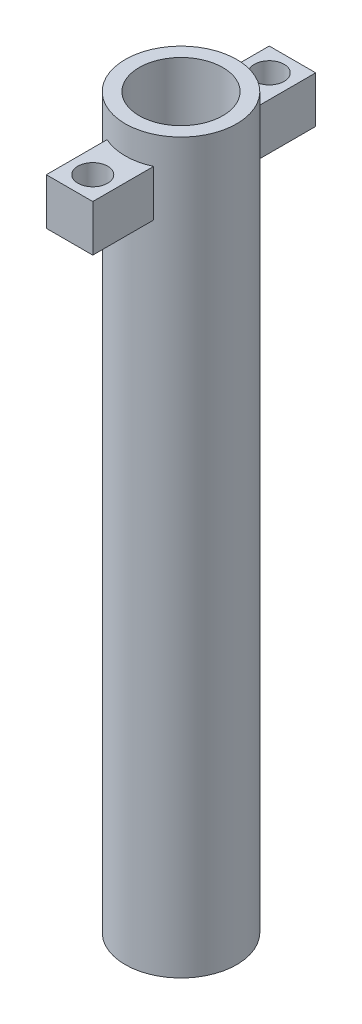
ISO-10303-21;
HEADER;
FILE_DESCRIPTION(('STEP AP214'),'2;1');
FILE_NAME('part.step','',(''),(''),'','','');
FILE_SCHEMA(('AUTOMOTIVE_DESIGN { 1 0 10303 214 1 1 1 1 }'));
ENDSEC;
DATA;
#1=APPLICATION_CONTEXT('core data for automotive mechanical design processes');
#2=APPLICATION_PROTOCOL_DEFINITION('international standard','automotive_design',2000,#1);
#3=PRODUCT_CONTEXT('',#1,'mechanical');
#4=PRODUCT('Part','Part','',(#3));
#5=PRODUCT_RELATED_PRODUCT_CATEGORY('part','',(#4));
#6=PRODUCT_DEFINITION_FORMATION('','',#4);
#7=PRODUCT_DEFINITION_CONTEXT('part definition',#1,'design');
#8=PRODUCT_DEFINITION('design','',#6,#7);
#9=PRODUCT_DEFINITION_SHAPE('','',#8);
#10=(LENGTH_UNIT() NAMED_UNIT(*) SI_UNIT(.MILLI.,.METRE.));
#11=(NAMED_UNIT(*) PLANE_ANGLE_UNIT() SI_UNIT($,.RADIAN.));
#12=(NAMED_UNIT(*) SI_UNIT($,.STERADIAN.) SOLID_ANGLE_UNIT());
#13=UNCERTAINTY_MEASURE_WITH_UNIT(LENGTH_MEASURE(1.E-05),#10,'distance_accuracy_value','');
#14=(GEOMETRIC_REPRESENTATION_CONTEXT(3) GLOBAL_UNCERTAINTY_ASSIGNED_CONTEXT((#13)) GLOBAL_UNIT_ASSIGNED_CONTEXT((#10,
#11,#12)) REPRESENTATION_CONTEXT('',''));
#15=CARTESIAN_POINT('',(0.,0.,0.));
#16=DIRECTION('',(0.,0.,1.));
#17=DIRECTION('',(1.,0.,0.));
#18=AXIS2_PLACEMENT_3D('',#15,#16,#17);
#19=CARTESIAN_POINT('',(0.,78.4,0.));
#20=DIRECTION('',(0.,1.,0.));
#21=DIRECTION('',(0.,0.,1.));
#22=AXIS2_PLACEMENT_3D('',#19,#20,#21);
#23=PLANE('',#22);
#24=CARTESIAN_POINT('',(0.,78.4,0.));
#25=DIRECTION('',(0.,1.,0.));
#26=DIRECTION('',(0.,0.,1.));
#27=AXIS2_PLACEMENT_3D('',#24,#25,#26);
#28=CIRCLE('',#27,4.5);
#29=CARTESIAN_POINT('',(0.,78.4,4.5));
#30=VERTEX_POINT('',#29);
#31=EDGE_CURVE('E150',#30,#30,#28,.T.);
#32=ORIENTED_EDGE('',*,*,#31,.F.);
#33=EDGE_LOOP('',(#32));
#34=FACE_BOUND('',#33,.T.);
#35=CARTESIAN_POINT('',(0.,78.4,0.));
#36=DIRECTION('',(0.,1.,0.));
#37=DIRECTION('',(0.,0.,1.));
#38=AXIS2_PLACEMENT_3D('',#35,#36,#37);
#39=CIRCLE('',#38,6.);
#40=CARTESIAN_POINT('',(0.,78.4,6.));
#41=VERTEX_POINT('',#40);
#42=EDGE_CURVE('E12',#41,#41,#39,.T.);
#43=ORIENTED_EDGE('',*,*,#42,.T.);
#44=EDGE_LOOP('',(#43));
#45=FACE_BOUND('',#44,.T.);
#46=ADVANCED_FACE('F39',(#34,#45),#23,.T.);
#47=CARTESIAN_POINT('',(-2.5,70.4,12.));
#48=DIRECTION('',(0.,0.,1.));
#49=DIRECTION('',(1.,0.,0.));
#50=AXIS2_PLACEMENT_3D('',#47,#48,#49);
#51=PLANE('',#50);
#52=DIRECTION('',(0.,1.,0.));
#53=VECTOR('',#52,1.);
#54=CARTESIAN_POINT('',(2.5,70.4,12.));
#55=LINE('',#54,#53);
#56=CARTESIAN_POINT('',(2.5,70.4,12.));
#57=VERTEX_POINT('',#56);
#58=CARTESIAN_POINT('',(2.5,75.4,12.));
#59=VERTEX_POINT('',#58);
#60=EDGE_CURVE('E135',#57,#59,#55,.T.);
#61=ORIENTED_EDGE('',*,*,#60,.T.);
#62=DIRECTION('',(-1.,0.,0.));
#63=VECTOR('',#62,1.);
#64=CARTESIAN_POINT('',(-2.5,75.4,12.));
#65=LINE('',#64,#63);
#66=CARTESIAN_POINT('',(-2.5,75.4,12.));
#67=VERTEX_POINT('',#66);
#68=EDGE_CURVE('E217',#59,#67,#65,.T.);
#69=ORIENTED_EDGE('',*,*,#68,.T.);
#70=DIRECTION('',(0.,1.,0.));
#71=VECTOR('',#70,1.);
#72=CARTESIAN_POINT('',(-2.5,70.4,12.));
#73=LINE('',#72,#71);
#74=CARTESIAN_POINT('',(-2.5,70.4,12.));
#75=VERTEX_POINT('',#74);
#76=EDGE_CURVE('E141',#75,#67,#73,.T.);
#77=ORIENTED_EDGE('',*,*,#76,.F.);
#78=DIRECTION('',(1.,0.,0.));
#79=VECTOR('',#78,1.);
#80=CARTESIAN_POINT('',(-2.5,70.4,12.));
#81=LINE('',#80,#79);
#82=EDGE_CURVE('E216',#75,#57,#81,.T.);
#83=ORIENTED_EDGE('',*,*,#82,.T.);
#84=EDGE_LOOP('',(#61,#69,#77,#83));
#85=FACE_BOUND('',#84,.T.);
#86=ADVANCED_FACE('F180',(#85),#51,.T.);
#87=CARTESIAN_POINT('',(0.,70.4,9.5));
#88=DIRECTION('',(0.,1.,0.));
#89=DIRECTION('',(0.,0.,1.));
#90=AXIS2_PLACEMENT_3D('',#87,#88,#89);
#91=CYLINDRICAL_SURFACE('',#90,1.6);
#92=CARTESIAN_POINT('',(0.,70.4,9.5));
#93=DIRECTION('',(0.,1.,0.));
#94=DIRECTION('',(0.,0.,1.));
#95=AXIS2_PLACEMENT_3D('',#92,#93,#94);
#96=CIRCLE('',#95,1.6);
#97=CARTESIAN_POINT('',(0.,70.4,11.1));
#98=VERTEX_POINT('',#97);
#99=EDGE_CURVE('E251',#98,#98,#96,.T.);
#100=ORIENTED_EDGE('',*,*,#99,.F.);
#101=EDGE_LOOP('',(#100));
#102=FACE_BOUND('',#101,.T.);
#103=CARTESIAN_POINT('',(0.,75.4,9.5));
#104=DIRECTION('',(0.,1.,0.));
#105=DIRECTION('',(0.,0.,1.));
#106=AXIS2_PLACEMENT_3D('',#103,#104,#105);
#107=CIRCLE('',#106,1.6);
#108=CARTESIAN_POINT('',(0.,75.4,11.1));
#109=VERTEX_POINT('',#108);
#110=EDGE_CURVE('E248',#109,#109,#107,.F.);
#111=ORIENTED_EDGE('',*,*,#110,.F.);
#112=EDGE_LOOP('',(#111));
#113=FACE_BOUND('',#112,.T.);
#114=ADVANCED_FACE('F186',(#102,#113),#91,.F.);
#115=CARTESIAN_POINT('',(-2.5,70.4,5.45435605731786));
#116=DIRECTION('',(-1.,0.,0.));
#117=DIRECTION('',(0.,0.,1.));
#118=AXIS2_PLACEMENT_3D('',#115,#116,#117);
#119=PLANE('',#118);
#120=ORIENTED_EDGE('',*,*,#76,.T.);
#121=DIRECTION('',(0.,0.,-1.));
#122=VECTOR('',#121,1.);
#123=CARTESIAN_POINT('',(-2.5,75.4,5.45435605731786));
#124=LINE('',#123,#122);
#125=CARTESIAN_POINT('',(-2.5,75.4,5.45435605731786));
#126=VERTEX_POINT('',#125);
#127=EDGE_CURVE('E210',#67,#126,#124,.T.);
#128=ORIENTED_EDGE('',*,*,#127,.T.);
#129=DIRECTION('',(0.,1.,0.));
#130=VECTOR('',#129,1.);
#131=CARTESIAN_POINT('',(-2.5,70.4,5.45435605731786));
#132=LINE('',#131,#130);
#133=CARTESIAN_POINT('',(-2.5,70.4,5.45435605731786));
#134=VERTEX_POINT('',#133);
#135=EDGE_CURVE('E144',#134,#126,#132,.T.);
#136=ORIENTED_EDGE('',*,*,#135,.F.);
#137=DIRECTION('',(0.,0.,1.));
#138=VECTOR('',#137,1.);
#139=CARTESIAN_POINT('',(-2.5,70.4,5.45435605731786));
#140=LINE('',#139,#138);
#141=EDGE_CURVE('E212',#134,#75,#140,.T.);
#142=ORIENTED_EDGE('',*,*,#141,.T.);
#143=EDGE_LOOP('',(#120,#128,#136,#142));
#144=FACE_BOUND('',#143,.T.);
#145=ADVANCED_FACE('F195',(#144),#119,.T.);
#146=CARTESIAN_POINT('',(2.5,70.4,5.45435605731786));
#147=DIRECTION('',(1.,0.,0.));
#148=DIRECTION('',(0.,0.,-1.));
#149=AXIS2_PLACEMENT_3D('',#146,#147,#148);
#150=PLANE('',#149);
#151=DIRECTION('',(0.,1.,0.));
#152=VECTOR('',#151,1.);
#153=CARTESIAN_POINT('',(2.5,70.4,5.45435605731786));
#154=LINE('',#153,#152);
#155=CARTESIAN_POINT('',(2.5,70.4,5.45435605731786));
#156=VERTEX_POINT('',#155);
#157=CARTESIAN_POINT('',(2.5,75.4,5.45435605731786));
#158=VERTEX_POINT('',#157);
#159=EDGE_CURVE('E130',#156,#158,#154,.T.);
#160=ORIENTED_EDGE('',*,*,#159,.T.);
#161=DIRECTION('',(0.,0.,1.));
#162=VECTOR('',#161,1.);
#163=CARTESIAN_POINT('',(2.5,75.4,5.45435605731786));
#164=LINE('',#163,#162);
#165=EDGE_CURVE('E240',#158,#59,#164,.T.);
#166=ORIENTED_EDGE('',*,*,#165,.T.);
#167=ORIENTED_EDGE('',*,*,#60,.F.);
#168=DIRECTION('',(0.,0.,-1.));
#169=VECTOR('',#168,1.);
#170=CARTESIAN_POINT('',(2.5,70.4,5.45435605731786));
#171=LINE('',#170,#169);
#172=EDGE_CURVE('E222',#57,#156,#171,.T.);
#173=ORIENTED_EDGE('',*,*,#172,.T.);
#174=EDGE_LOOP('',(#160,#166,#167,#173));
#175=FACE_BOUND('',#174,.T.);
#176=ADVANCED_FACE('F199',(#175),#150,.T.);
#177=CARTESIAN_POINT('',(-2.5,70.4,-12.));
#178=DIRECTION('',(-1.,0.,0.));
#179=DIRECTION('',(0.,0.,1.));
#180=AXIS2_PLACEMENT_3D('',#177,#178,#179);
#181=PLANE('',#180);
#182=DIRECTION('',(0.,1.,0.));
#183=VECTOR('',#182,1.);
#184=CARTESIAN_POINT('',(-2.5,70.4,-5.45435605731786));
#185=LINE('',#184,#183);
#186=CARTESIAN_POINT('',(-2.5,70.4,-5.45435605731786));
#187=VERTEX_POINT('',#186);
#188=CARTESIAN_POINT('',(-2.5,75.4,-5.45435605731786));
#189=VERTEX_POINT('',#188);
#190=EDGE_CURVE('E149',#187,#189,#185,.T.);
#191=ORIENTED_EDGE('',*,*,#190,.T.);
#192=DIRECTION('',(0.,0.,-1.));
#193=VECTOR('',#192,1.);
#194=CARTESIAN_POINT('',(-2.5,75.4,-12.));
#195=LINE('',#194,#193);
#196=CARTESIAN_POINT('',(-2.5,75.4,-12.));
#197=VERTEX_POINT('',#196);
#198=EDGE_CURVE('E115',#189,#197,#195,.T.);
#199=ORIENTED_EDGE('',*,*,#198,.T.);
#200=DIRECTION('',(0.,1.,0.));
#201=VECTOR('',#200,1.);
#202=CARTESIAN_POINT('',(-2.5,70.4,-12.));
#203=LINE('',#202,#201);
#204=CARTESIAN_POINT('',(-2.5,70.4,-12.));
#205=VERTEX_POINT('',#204);
#206=EDGE_CURVE('E132',#205,#197,#203,.T.);
#207=ORIENTED_EDGE('',*,*,#206,.F.);
#208=DIRECTION('',(0.,0.,1.));
#209=VECTOR('',#208,1.);
#210=CARTESIAN_POINT('',(-2.5,70.4,-12.));
#211=LINE('',#210,#209);
#212=EDGE_CURVE('E146',#205,#187,#211,.T.);
#213=ORIENTED_EDGE('',*,*,#212,.T.);
#214=EDGE_LOOP('',(#191,#199,#207,#213));
#215=FACE_BOUND('',#214,.T.);
#216=ADVANCED_FACE('F206',(#215),#181,.T.);
#217=CARTESIAN_POINT('',(-2.5,70.4,-12.));
#218=DIRECTION('',(0.,0.,-1.));
#219=DIRECTION('',(-1.,0.,0.));
#220=AXIS2_PLACEMENT_3D('',#217,#218,#219);
#221=PLANE('',#220);
#222=ORIENTED_EDGE('',*,*,#206,.T.);
#223=DIRECTION('',(1.,0.,0.));
#224=VECTOR('',#223,1.);
#225=CARTESIAN_POINT('',(-2.5,75.4,-12.));
#226=LINE('',#225,#224);
#227=CARTESIAN_POINT('',(2.5,75.4,-12.));
#228=VERTEX_POINT('',#227);
#229=EDGE_CURVE('E127',#197,#228,#226,.T.);
#230=ORIENTED_EDGE('',*,*,#229,.T.);
#231=DIRECTION('',(0.,1.,0.));
#232=VECTOR('',#231,1.);
#233=CARTESIAN_POINT('',(2.5,70.4,-12.));
#234=LINE('',#233,#232);
#235=CARTESIAN_POINT('',(2.5,70.4,-12.));
#236=VERTEX_POINT('',#235);
#237=EDGE_CURVE('E126',#236,#228,#234,.T.);
#238=ORIENTED_EDGE('',*,*,#237,.F.);
#239=DIRECTION('',(-1.,0.,0.));
#240=VECTOR('',#239,1.);
#241=CARTESIAN_POINT('',(-2.5,70.4,-12.));
#242=LINE('',#241,#240);
#243=EDGE_CURVE('E231',#236,#205,#242,.T.);
#244=ORIENTED_EDGE('',*,*,#243,.T.);
#245=EDGE_LOOP('',(#222,#230,#238,#244));
#246=FACE_BOUND('',#245,.T.);
#247=ADVANCED_FACE('F237',(#246),#221,.T.);
#248=CARTESIAN_POINT('',(2.5,70.4,-12.));
#249=DIRECTION('',(1.,0.,0.));
#250=DIRECTION('',(0.,0.,-1.));
#251=AXIS2_PLACEMENT_3D('',#248,#249,#250);
#252=PLANE('',#251);
#253=ORIENTED_EDGE('',*,*,#237,.T.);
#254=DIRECTION('',(0.,0.,1.));
#255=VECTOR('',#254,1.);
#256=CARTESIAN_POINT('',(2.5,75.4,-12.));
#257=LINE('',#256,#255);
#258=CARTESIAN_POINT('',(2.5,75.4,-5.45435605731786));
#259=VERTEX_POINT('',#258);
#260=EDGE_CURVE('E112',#228,#259,#257,.T.);
#261=ORIENTED_EDGE('',*,*,#260,.T.);
#262=DIRECTION('',(0.,1.,0.));
#263=VECTOR('',#262,1.);
#264=CARTESIAN_POINT('',(2.5,70.4,-5.45435605731786));
#265=LINE('',#264,#263);
#266=CARTESIAN_POINT('',(2.5,70.4,-5.45435605731786));
#267=VERTEX_POINT('',#266);
#268=EDGE_CURVE('E125',#267,#259,#265,.T.);
#269=ORIENTED_EDGE('',*,*,#268,.F.);
#270=DIRECTION('',(0.,0.,-1.));
#271=VECTOR('',#270,1.);
#272=CARTESIAN_POINT('',(2.5,70.4,-12.));
#273=LINE('',#272,#271);
#274=EDGE_CURVE('E224',#267,#236,#273,.T.);
#275=ORIENTED_EDGE('',*,*,#274,.T.);
#276=EDGE_LOOP('',(#253,#261,#269,#275));
#277=FACE_BOUND('',#276,.T.);
#278=ADVANCED_FACE('F123',(#277),#252,.T.);
#279=CARTESIAN_POINT('',(0.,70.4,-9.5));
#280=DIRECTION('',(0.,1.,0.));
#281=DIRECTION('',(0.,0.,1.));
#282=AXIS2_PLACEMENT_3D('',#279,#280,#281);
#283=CYLINDRICAL_SURFACE('',#282,1.6);
#284=CARTESIAN_POINT('',(0.,70.4,-9.5));
#285=DIRECTION('',(0.,1.,0.));
#286=DIRECTION('',(0.,0.,1.));
#287=AXIS2_PLACEMENT_3D('',#284,#285,#286);
#288=CIRCLE('',#287,1.6);
#289=CARTESIAN_POINT('',(0.,70.4,-7.9));
#290=VERTEX_POINT('',#289);
#291=EDGE_CURVE('E226',#290,#290,#288,.T.);
#292=ORIENTED_EDGE('',*,*,#291,.F.);
#293=EDGE_LOOP('',(#292));
#294=FACE_BOUND('',#293,.T.);
#295=CARTESIAN_POINT('',(0.,75.4,-9.5));
#296=DIRECTION('',(0.,1.,0.));
#297=DIRECTION('',(0.,0.,1.));
#298=AXIS2_PLACEMENT_3D('',#295,#296,#297);
#299=CIRCLE('',#298,1.6);
#300=CARTESIAN_POINT('',(0.,75.4,-7.9));
#301=VERTEX_POINT('',#300);
#302=EDGE_CURVE('E43',#301,#301,#299,.F.);
#303=ORIENTED_EDGE('',*,*,#302,.F.);
#304=EDGE_LOOP('',(#303));
#305=FACE_BOUND('',#304,.T.);
#306=ADVANCED_FACE('F162',(#294,#305),#283,.F.);
#307=CARTESIAN_POINT('',(0.,0.,0.));
#308=DIRECTION('',(0.,1.,0.));
#309=DIRECTION('',(0.,0.,1.));
#310=AXIS2_PLACEMENT_3D('',#307,#308,#309);
#311=PLANE('',#310);
#312=CARTESIAN_POINT('',(0.,0.,0.));
#313=DIRECTION('',(0.,1.,0.));
#314=DIRECTION('',(0.,0.,1.));
#315=AXIS2_PLACEMENT_3D('',#312,#313,#314);
#316=CIRCLE('',#315,6.);
#317=CARTESIAN_POINT('',(0.,0.,6.));
#318=VERTEX_POINT('',#317);
#319=EDGE_CURVE('E48',#318,#318,#316,.T.);
#320=ORIENTED_EDGE('',*,*,#319,.F.);
#321=EDGE_LOOP('',(#320));
#322=FACE_BOUND('',#321,.T.);
#323=CARTESIAN_POINT('',(0.,0.,0.));
#324=DIRECTION('',(0.,1.,0.));
#325=DIRECTION('',(0.,0.,1.));
#326=AXIS2_PLACEMENT_3D('',#323,#324,#325);
#327=CIRCLE('',#326,4.5);
#328=CARTESIAN_POINT('',(0.,0.,4.5));
#329=VERTEX_POINT('',#328);
#330=EDGE_CURVE('E153',#329,#329,#327,.T.);
#331=ORIENTED_EDGE('',*,*,#330,.T.);
#332=EDGE_LOOP('',(#331));
#333=FACE_BOUND('',#332,.T.);
#334=ADVANCED_FACE('F159',(#322,#333),#311,.F.);
#335=CARTESIAN_POINT('',(0.,78.4,0.));
#336=DIRECTION('',(0.,-1.,0.));
#337=DIRECTION('',(0.,0.,-1.));
#338=AXIS2_PLACEMENT_3D('',#335,#336,#337);
#339=CYLINDRICAL_SURFACE('',#338,6.);
#340=ORIENTED_EDGE('',*,*,#268,.T.);
#341=CARTESIAN_POINT('',(0.,75.4,0.));
#342=DIRECTION('',(0.,1.,0.));
#343=DIRECTION('',(0.,0.,1.));
#344=AXIS2_PLACEMENT_3D('',#341,#342,#343);
#345=CIRCLE('',#344,6.);
#346=EDGE_CURVE('E108',#259,#189,#345,.T.);
#347=ORIENTED_EDGE('',*,*,#346,.T.);
#348=ORIENTED_EDGE('',*,*,#190,.F.);
#349=CARTESIAN_POINT('',(0.,70.4,0.));
#350=DIRECTION('',(0.,1.,0.));
#351=DIRECTION('',(0.,0.,1.));
#352=AXIS2_PLACEMENT_3D('',#349,#350,#351);
#353=CIRCLE('',#352,6.);
#354=EDGE_CURVE('E64',#267,#187,#353,.T.);
#355=ORIENTED_EDGE('',*,*,#354,.F.);
#356=EDGE_LOOP('',(#340,#347,#348,#355));
#357=FACE_BOUND('',#356,.T.);
#358=ORIENTED_EDGE('',*,*,#42,.F.);
#359=EDGE_LOOP('',(#358));
#360=FACE_BOUND('',#359,.T.);
#361=EDGE_CURVE('E56',#126,#158,#345,.T.);
#362=ORIENTED_EDGE('',*,*,#361,.T.);
#363=ORIENTED_EDGE('',*,*,#159,.F.);
#364=EDGE_CURVE('E147',#134,#156,#353,.T.);
#365=ORIENTED_EDGE('',*,*,#364,.F.);
#366=ORIENTED_EDGE('',*,*,#135,.T.);
#367=EDGE_LOOP('',(#362,#363,#365,#366));
#368=FACE_BOUND('',#367,.T.);
#369=ORIENTED_EDGE('',*,*,#319,.T.);
#370=EDGE_LOOP('',(#369));
#371=FACE_BOUND('',#370,.T.);
#372=ADVANCED_FACE('F41',(#357,#360,#368,#371),#339,.T.);
#373=CARTESIAN_POINT('',(0.,78.4,0.));
#374=DIRECTION('',(0.,-1.,0.));
#375=DIRECTION('',(0.,0.,-1.));
#376=AXIS2_PLACEMENT_3D('',#373,#374,#375);
#377=CYLINDRICAL_SURFACE('',#376,4.5);
#378=ORIENTED_EDGE('',*,*,#31,.T.);
#379=EDGE_LOOP('',(#378));
#380=FACE_BOUND('',#379,.T.);
#381=ORIENTED_EDGE('',*,*,#330,.F.);
#382=EDGE_LOOP('',(#381));
#383=FACE_BOUND('',#382,.T.);
#384=ADVANCED_FACE('F165',(#380,#383),#377,.F.);
#385=CARTESIAN_POINT('',(0.,70.4,0.));
#386=DIRECTION('',(0.,1.,0.));
#387=DIRECTION('',(0.,0.,1.));
#388=AXIS2_PLACEMENT_3D('',#385,#386,#387);
#389=PLANE('',#388);
#390=ORIENTED_EDGE('',*,*,#99,.T.);
#391=EDGE_LOOP('',(#390));
#392=FACE_BOUND('',#391,.T.);
#393=ORIENTED_EDGE('',*,*,#141,.F.);
#394=ORIENTED_EDGE('',*,*,#364,.T.);
#395=ORIENTED_EDGE('',*,*,#172,.F.);
#396=ORIENTED_EDGE('',*,*,#82,.F.);
#397=EDGE_LOOP('',(#393,#394,#395,#396));
#398=FACE_BOUND('',#397,.T.);
#399=ADVANCED_FACE('F167',(#392,#398),#389,.F.);
#400=ORIENTED_EDGE('',*,*,#291,.T.);
#401=EDGE_LOOP('',(#400));
#402=FACE_BOUND('',#401,.T.);
#403=ORIENTED_EDGE('',*,*,#274,.F.);
#404=ORIENTED_EDGE('',*,*,#354,.T.);
#405=ORIENTED_EDGE('',*,*,#212,.F.);
#406=ORIENTED_EDGE('',*,*,#243,.F.);
#407=EDGE_LOOP('',(#403,#404,#405,#406));
#408=FACE_BOUND('',#407,.T.);
#409=ADVANCED_FACE('F173',(#402,#408),#389,.F.);
#410=CARTESIAN_POINT('',(0.,75.4,0.));
#411=DIRECTION('',(0.,1.,0.));
#412=DIRECTION('',(0.,0.,1.));
#413=AXIS2_PLACEMENT_3D('',#410,#411,#412);
#414=PLANE('',#413);
#415=ORIENTED_EDGE('',*,*,#346,.F.);
#416=ORIENTED_EDGE('',*,*,#260,.F.);
#417=ORIENTED_EDGE('',*,*,#229,.F.);
#418=ORIENTED_EDGE('',*,*,#198,.F.);
#419=EDGE_LOOP('',(#415,#416,#417,#418));
#420=FACE_BOUND('',#419,.T.);
#421=ORIENTED_EDGE('',*,*,#302,.T.);
#422=EDGE_LOOP('',(#421));
#423=FACE_BOUND('',#422,.T.);
#424=ADVANCED_FACE('F110',(#420,#423),#414,.T.);
#425=ORIENTED_EDGE('',*,*,#68,.F.);
#426=ORIENTED_EDGE('',*,*,#165,.F.);
#427=ORIENTED_EDGE('',*,*,#361,.F.);
#428=ORIENTED_EDGE('',*,*,#127,.F.);
#429=EDGE_LOOP('',(#425,#426,#427,#428));
#430=FACE_BOUND('',#429,.T.);
#431=ORIENTED_EDGE('',*,*,#110,.T.);
#432=EDGE_LOOP('',(#431));
#433=FACE_BOUND('',#432,.T.);
#434=ADVANCED_FACE('F263',(#430,#433),#414,.T.);
#435=CLOSED_SHELL('',(#46,#86,#114,#145,#176,#216,#247,#278,#306,#334,#372,#384,#399,#409,#424,#434));
#436=MANIFOLD_SOLID_BREP('B2',#435);
#437=ADVANCED_BREP_SHAPE_REPRESENTATION('',(#18,#436),#14);
#438=SHAPE_DEFINITION_REPRESENTATION(#9,#437);
ENDSEC;
END-ISO-10303-21;
